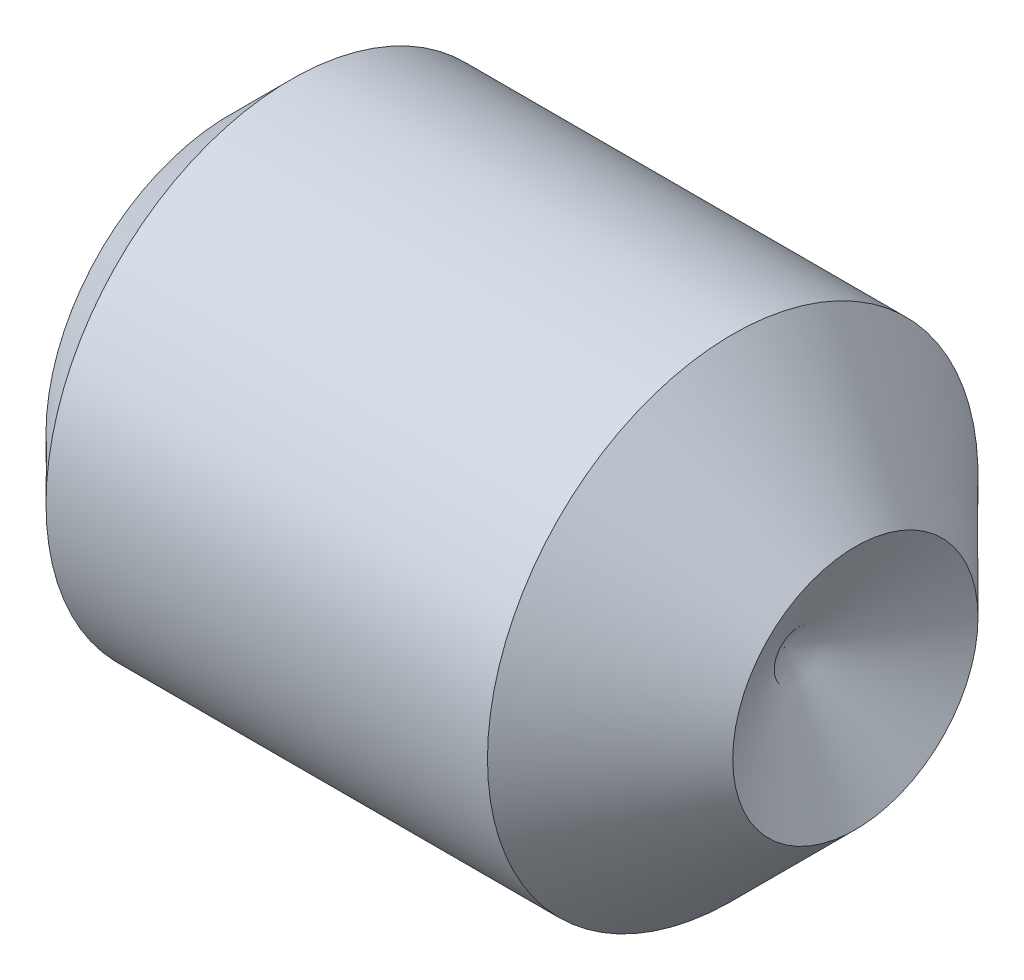
ISO-10303-21;
HEADER;
FILE_DESCRIPTION(('STEP AP214'),'2;1');
FILE_NAME('part.step','',(''),(''),'','','');
FILE_SCHEMA(('AUTOMOTIVE_DESIGN { 1 0 10303 214 1 1 1 1 }'));
ENDSEC;
DATA;
#1=APPLICATION_CONTEXT('core data for automotive mechanical design processes');
#2=APPLICATION_PROTOCOL_DEFINITION('international standard','automotive_design',2000,#1);
#3=PRODUCT_CONTEXT('',#1,'mechanical');
#4=PRODUCT('Part','Part','',(#3));
#5=PRODUCT_RELATED_PRODUCT_CATEGORY('part','',(#4));
#6=PRODUCT_DEFINITION_FORMATION('','',#4);
#7=PRODUCT_DEFINITION_CONTEXT('part definition',#1,'design');
#8=PRODUCT_DEFINITION('design','',#6,#7);
#9=PRODUCT_DEFINITION_SHAPE('','',#8);
#10=(LENGTH_UNIT() NAMED_UNIT(*) SI_UNIT(.MILLI.,.METRE.));
#11=(NAMED_UNIT(*) PLANE_ANGLE_UNIT() SI_UNIT($,.RADIAN.));
#12=(NAMED_UNIT(*) SI_UNIT($,.STERADIAN.) SOLID_ANGLE_UNIT());
#13=UNCERTAINTY_MEASURE_WITH_UNIT(LENGTH_MEASURE(1.E-05),#10,'distance_accuracy_value','');
#14=(GEOMETRIC_REPRESENTATION_CONTEXT(3) GLOBAL_UNCERTAINTY_ASSIGNED_CONTEXT((#13)) GLOBAL_UNIT_ASSIGNED_CONTEXT((#10,
#11,#12)) REPRESENTATION_CONTEXT('',''));
#15=CARTESIAN_POINT('',(0.,0.,0.));
#16=DIRECTION('',(0.,0.,1.));
#17=DIRECTION('',(1.,0.,0.));
#18=AXIS2_PLACEMENT_3D('',#15,#16,#17);
#19=CARTESIAN_POINT('',(2.,-0.999999999999993,0.57735026918962));
#20=DIRECTION('',(0.,-0.5,0.866025403784439));
#21=DIRECTION('',(0.,-0.866025403784439,-0.5));
#22=AXIS2_PLACEMENT_3D('',#19,#20,#21);
#23=PLANE('',#22);
#24=DIRECTION('',(1.,0.,0.));
#25=VECTOR('',#24,1.);
#26=CARTESIAN_POINT('',(2.,0.,1.15470053837925));
#27=LINE('',#26,#25);
#28=CARTESIAN_POINT('',(2.,0.,1.15470053837925));
#29=VERTEX_POINT('',#28);
#30=CARTESIAN_POINT('',(0.,0.,1.15470053837925));
#31=VERTEX_POINT('',#30);
#32=EDGE_CURVE('E87',#29,#31,#27,.F.);
#33=ORIENTED_EDGE('',*,*,#32,.F.);
#34=DIRECTION('',(0.,-0.866025403784439,-0.5));
#35=VECTOR('',#34,1.);
#36=CARTESIAN_POINT('',(2.,-0.999999999999993,0.57735026918962));
#37=LINE('',#36,#35);
#38=CARTESIAN_POINT('',(2.,-0.999999999999993,0.57735026918962));
#39=VERTEX_POINT('',#38);
#40=EDGE_CURVE('E69',#39,#29,#37,.F.);
#41=ORIENTED_EDGE('',*,*,#40,.F.);
#42=DIRECTION('',(1.,0.,0.));
#43=VECTOR('',#42,1.);
#44=CARTESIAN_POINT('',(2.,-0.999999999999993,0.57735026918962));
#45=LINE('',#44,#43);
#46=CARTESIAN_POINT('',(0.,-0.999999999999993,0.57735026918962));
#47=VERTEX_POINT('',#46);
#48=EDGE_CURVE('E90',#47,#39,#45,.T.);
#49=ORIENTED_EDGE('',*,*,#48,.F.);
#50=DIRECTION('',(0.,-0.866025403784439,-0.5));
#51=VECTOR('',#50,1.);
#52=CARTESIAN_POINT('',(0.,-0.999999999999993,0.57735026918962));
#53=LINE('',#52,#51);
#54=EDGE_CURVE('E77',#31,#47,#53,.T.);
#55=ORIENTED_EDGE('',*,*,#54,.F.);
#56=EDGE_LOOP('',(#33,#41,#49,#55));
#57=FACE_BOUND('',#56,.T.);
#58=ADVANCED_FACE('F17',(#57),#23,.F.);
#59=CARTESIAN_POINT('',(2.,1.,0.577350269189621));
#60=DIRECTION('',(0.,-0.499999999999999,-0.866025403784439));
#61=DIRECTION('',(0.,0.866025403784439,-0.499999999999999));
#62=AXIS2_PLACEMENT_3D('',#59,#60,#61);
#63=PLANE('',#62);
#64=DIRECTION('',(0.,0.866025403784439,-0.499999999999999));
#65=VECTOR('',#64,1.);
#66=CARTESIAN_POINT('',(2.,1.,0.577350269189621));
#67=LINE('',#66,#65);
#68=CARTESIAN_POINT('',(2.,1.,0.577350269189622));
#69=VERTEX_POINT('',#68);
#70=EDGE_CURVE('E84',#69,#29,#67,.F.);
#71=ORIENTED_EDGE('',*,*,#70,.T.);
#72=ORIENTED_EDGE('',*,*,#32,.T.);
#73=DIRECTION('',(0.,0.866025403784439,-0.499999999999999));
#74=VECTOR('',#73,1.);
#75=CARTESIAN_POINT('',(0.,1.,0.577350269189621));
#76=LINE('',#75,#74);
#77=CARTESIAN_POINT('',(0.,1.,0.577350269189622));
#78=VERTEX_POINT('',#77);
#79=EDGE_CURVE('E73',#31,#78,#76,.T.);
#80=ORIENTED_EDGE('',*,*,#79,.T.);
#81=DIRECTION('',(1.,0.,0.));
#82=VECTOR('',#81,1.);
#83=CARTESIAN_POINT('',(2.,1.,0.577350269189621));
#84=LINE('',#83,#82);
#85=EDGE_CURVE('E100',#78,#69,#84,.T.);
#86=ORIENTED_EDGE('',*,*,#85,.T.);
#87=EDGE_LOOP('',(#71,#72,#80,#86));
#88=FACE_BOUND('',#87,.T.);
#89=ADVANCED_FACE('F93',(#88),#63,.T.);
#90=CARTESIAN_POINT('',(2.,-0.999999999999993,0.57735026918962));
#91=DIRECTION('',(0.,1.,0.));
#92=DIRECTION('',(0.,0.,1.));
#93=AXIS2_PLACEMENT_3D('',#90,#91,#92);
#94=PLANE('',#93);
#95=DIRECTION('',(0.,0.,-1.));
#96=VECTOR('',#95,1.);
#97=CARTESIAN_POINT('',(2.,-0.999999999999993,0.577350269189621));
#98=LINE('',#97,#96);
#99=CARTESIAN_POINT('',(2.,-0.999999999999993,-0.577350269189629));
#100=VERTEX_POINT('',#99);
#101=EDGE_CURVE('E103',#39,#100,#98,.T.);
#102=ORIENTED_EDGE('',*,*,#101,.T.);
#103=DIRECTION('',(1.,0.,0.));
#104=VECTOR('',#103,1.);
#105=CARTESIAN_POINT('',(2.,-0.999999999999993,-0.577350269189629));
#106=LINE('',#105,#104);
#107=CARTESIAN_POINT('',(0.,-0.999999999999993,-0.577350269189629));
#108=VERTEX_POINT('',#107);
#109=EDGE_CURVE('E109',#108,#100,#106,.T.);
#110=ORIENTED_EDGE('',*,*,#109,.F.);
#111=DIRECTION('',(0.,0.,1.));
#112=VECTOR('',#111,1.);
#113=CARTESIAN_POINT('',(0.,-0.999999999999993,0.57735026918962));
#114=LINE('',#113,#112);
#115=EDGE_CURVE('E94',#108,#47,#114,.T.);
#116=ORIENTED_EDGE('',*,*,#115,.T.);
#117=ORIENTED_EDGE('',*,*,#48,.T.);
#118=EDGE_LOOP('',(#102,#110,#116,#117));
#119=FACE_BOUND('',#118,.T.);
#120=ADVANCED_FACE('F216',(#119),#94,.T.);
#121=CARTESIAN_POINT('',(2.,1.,0.577350269189621));
#122=DIRECTION('',(0.,1.,0.));
#123=DIRECTION('',(0.,0.,1.));
#124=AXIS2_PLACEMENT_3D('',#121,#122,#123);
#125=PLANE('',#124);
#126=DIRECTION('',(1.,0.,0.));
#127=VECTOR('',#126,1.);
#128=CARTESIAN_POINT('',(2.,1.,-0.577350269189628));
#129=LINE('',#128,#127);
#130=CARTESIAN_POINT('',(0.,1.,-0.577350269189628));
#131=VERTEX_POINT('',#130);
#132=CARTESIAN_POINT('',(2.,1.,-0.577350269189628));
#133=VERTEX_POINT('',#132);
#134=EDGE_CURVE('E115',#131,#133,#129,.T.);
#135=ORIENTED_EDGE('',*,*,#134,.T.);
#136=DIRECTION('',(0.,0.,-1.));
#137=VECTOR('',#136,1.);
#138=CARTESIAN_POINT('',(2.,1.,0.577350269189621));
#139=LINE('',#138,#137);
#140=EDGE_CURVE('E105',#133,#69,#139,.F.);
#141=ORIENTED_EDGE('',*,*,#140,.T.);
#142=ORIENTED_EDGE('',*,*,#85,.F.);
#143=DIRECTION('',(0.,0.,1.));
#144=VECTOR('',#143,1.);
#145=CARTESIAN_POINT('',(0.,1.,0.577350269189621));
#146=LINE('',#145,#144);
#147=EDGE_CURVE('E79',#131,#78,#146,.T.);
#148=ORIENTED_EDGE('',*,*,#147,.F.);
#149=EDGE_LOOP('',(#135,#141,#142,#148));
#150=FACE_BOUND('',#149,.T.);
#151=ADVANCED_FACE('F207',(#150),#125,.F.);
#152=CARTESIAN_POINT('',(2.,1.,0.577350269189621));
#153=DIRECTION('',(1.,0.,0.));
#154=DIRECTION('',(0.,0.,-1.));
#155=AXIS2_PLACEMENT_3D('',#152,#153,#154);
#156=PLANE('',#155);
#157=ORIENTED_EDGE('',*,*,#140,.F.);
#158=DIRECTION('',(0.,0.866025403784439,0.5));
#159=VECTOR('',#158,1.);
#160=CARTESIAN_POINT('',(2.,1.,-0.577350269189628));
#161=LINE('',#160,#159);
#162=CARTESIAN_POINT('',(2.,0.,-1.15470053837925));
#163=VERTEX_POINT('',#162);
#164=EDGE_CURVE('E117',#133,#163,#161,.F.);
#165=ORIENTED_EDGE('',*,*,#164,.T.);
#166=DIRECTION('',(0.,-0.866025403784439,0.499999999999999));
#167=VECTOR('',#166,1.);
#168=CARTESIAN_POINT('',(2.,-0.999999999999993,-0.577350269189629));
#169=LINE('',#168,#167);
#170=EDGE_CURVE('E112',#100,#163,#169,.F.);
#171=ORIENTED_EDGE('',*,*,#170,.F.);
#172=ORIENTED_EDGE('',*,*,#101,.F.);
#173=ORIENTED_EDGE('',*,*,#40,.T.);
#174=ORIENTED_EDGE('',*,*,#70,.F.);
#175=EDGE_LOOP('',(#157,#165,#171,#172,#173,#174));
#176=FACE_BOUND('',#175,.T.);
#177=ADVANCED_FACE('F197',(#176),#156,.F.);
#178=CARTESIAN_POINT('',(2.,-0.999999999999993,-0.577350269189629));
#179=DIRECTION('',(0.,0.499999999999999,0.866025403784439));
#180=DIRECTION('',(0.,-0.866025403784439,0.499999999999999));
#181=AXIS2_PLACEMENT_3D('',#178,#179,#180);
#182=PLANE('',#181);
#183=ORIENTED_EDGE('',*,*,#170,.T.);
#184=DIRECTION('',(1.,0.,0.));
#185=VECTOR('',#184,1.);
#186=CARTESIAN_POINT('',(2.,0.,-1.15470053837925));
#187=LINE('',#186,#185);
#188=CARTESIAN_POINT('',(0.,0.,-1.15470053837925));
#189=VERTEX_POINT('',#188);
#190=EDGE_CURVE('E119',#163,#189,#187,.F.);
#191=ORIENTED_EDGE('',*,*,#190,.T.);
#192=DIRECTION('',(0.,-0.866025403784439,0.499999999999999));
#193=VECTOR('',#192,1.);
#194=CARTESIAN_POINT('',(0.,-0.999999999999993,-0.577350269189629));
#195=LINE('',#194,#193);
#196=EDGE_CURVE('E35',#189,#108,#195,.T.);
#197=ORIENTED_EDGE('',*,*,#196,.T.);
#198=ORIENTED_EDGE('',*,*,#109,.T.);
#199=EDGE_LOOP('',(#183,#191,#197,#198));
#200=FACE_BOUND('',#199,.T.);
#201=ADVANCED_FACE('F187',(#200),#182,.T.);
#202=CARTESIAN_POINT('',(2.,1.,-0.577350269189628));
#203=DIRECTION('',(0.,0.5,-0.866025403784439));
#204=DIRECTION('',(0.,0.866025403784439,0.5));
#205=AXIS2_PLACEMENT_3D('',#202,#203,#204);
#206=PLANE('',#205);
#207=ORIENTED_EDGE('',*,*,#190,.F.);
#208=ORIENTED_EDGE('',*,*,#164,.F.);
#209=ORIENTED_EDGE('',*,*,#134,.F.);
#210=DIRECTION('',(0.,0.866025403784438,0.5));
#211=VECTOR('',#210,1.);
#212=CARTESIAN_POINT('',(0.,0.,-1.15470053837925));
#213=LINE('',#212,#211);
#214=EDGE_CURVE('E121',#189,#131,#213,.T.);
#215=ORIENTED_EDGE('',*,*,#214,.F.);
#216=EDGE_LOOP('',(#207,#208,#209,#215));
#217=FACE_BOUND('',#216,.T.);
#218=ADVANCED_FACE('F144',(#217),#206,.F.);
#219=CARTESIAN_POINT('',(5.1000000000001,0.,0.));
#220=DIRECTION('',(1.,0.,0.));
#221=DIRECTION('',(0.,0.,-1.));
#222=AXIS2_PLACEMENT_3D('',#219,#220,#221);
#223=CONICAL_SURFACE('',#222,1.00000000000011,1.04719755119659);
#224=CARTESIAN_POINT('',(4.5226497308104,0.,0.));
#225=VERTEX_POINT('',#224);
#226=VERTEX_LOOP('',#225);
#227=FACE_BOUND('',#226,.T.);
#228=CARTESIAN_POINT('',(5.09999999997035,0.,0.));
#229=DIRECTION('',(-1.,0.,0.));
#230=DIRECTION('',(0.,0.,1.));
#231=AXIS2_PLACEMENT_3D('',#228,#229,#230);
#232=CIRCLE('',#231,0.999999999976353);
#233=CARTESIAN_POINT('',(5.09999999997035,0.,0.999999999976353));
#234=VERTEX_POINT('',#233);
#235=EDGE_CURVE('E123',#234,#234,#232,.T.);
#236=ORIENTED_EDGE('',*,*,#235,.F.);
#237=EDGE_LOOP('',(#236));
#238=FACE_BOUND('',#237,.T.);
#239=ADVANCED_FACE('F135',(#227,#238),#223,.F.);
#240=CARTESIAN_POINT('',(0.,0.,0.));
#241=DIRECTION('',(-1.,0.,0.));
#242=DIRECTION('',(0.,0.,1.));
#243=AXIS2_PLACEMENT_3D('',#240,#241,#242);
#244=PLANE('',#243);
#245=ORIENTED_EDGE('',*,*,#196,.F.);
#246=ORIENTED_EDGE('',*,*,#214,.T.);
#247=ORIENTED_EDGE('',*,*,#147,.T.);
#248=ORIENTED_EDGE('',*,*,#79,.F.);
#249=ORIENTED_EDGE('',*,*,#54,.T.);
#250=ORIENTED_EDGE('',*,*,#115,.F.);
#251=EDGE_LOOP('',(#245,#246,#247,#248,#249,#250));
#252=FACE_BOUND('',#251,.T.);
#253=CARTESIAN_POINT('',(5.6843418860808E-11,0.,0.));
#254=DIRECTION('',(1.,0.,0.));
#255=DIRECTION('',(0.,0.,-1.));
#256=AXIS2_PLACEMENT_3D('',#253,#254,#255);
#257=CIRCLE('',#256,1.50000000002137);
#258=CARTESIAN_POINT('',(5.6843418860808E-11,0.,-1.50000000002137));
#259=VERTEX_POINT('',#258);
#260=EDGE_CURVE('E20',#259,#259,#257,.T.);
#261=ORIENTED_EDGE('',*,*,#260,.F.);
#262=EDGE_LOOP('',(#261));
#263=FACE_BOUND('',#262,.T.);
#264=ADVANCED_FACE('F75',(#252,#263),#244,.T.);
#265=CARTESIAN_POINT('',(4.09999999993715,0.,0.));
#266=DIRECTION('',(-1.,0.,0.));
#267=DIRECTION('',(0.,0.,1.));
#268=AXIS2_PLACEMENT_3D('',#265,#266,#267);
#269=CONICAL_SURFACE('',#268,2.00000000000955,0.785398163397448);
#270=CARTESIAN_POINT('',(4.1,0.,0.));
#271=DIRECTION('',(-1.,0.,0.));
#272=DIRECTION('',(0.,0.,1.));
#273=AXIS2_PLACEMENT_3D('',#270,#271,#272);
#274=CIRCLE('',#273,2.);
#275=CARTESIAN_POINT('',(4.1,0.,2.));
#276=VERTEX_POINT('',#275);
#277=EDGE_CURVE('E26',#276,#276,#274,.T.);
#278=ORIENTED_EDGE('',*,*,#277,.F.);
#279=EDGE_LOOP('',(#278));
#280=FACE_BOUND('',#279,.T.);
#281=ORIENTED_EDGE('',*,*,#235,.T.);
#282=EDGE_LOOP('',(#281));
#283=FACE_BOUND('',#282,.T.);
#284=ADVANCED_FACE('F134',(#280,#283),#269,.T.);
#285=CARTESIAN_POINT('',(0.50000000004502,0.,0.));
#286=DIRECTION('',(1.,0.,0.));
#287=DIRECTION('',(0.,0.,-1.));
#288=AXIS2_PLACEMENT_3D('',#285,#286,#287);
#289=CONICAL_SURFACE('',#288,2.00000000000955,0.785398163397448);
#290=CARTESIAN_POINT('',(0.499999999999997,0.,0.));
#291=DIRECTION('',(-1.,0.,0.));
#292=DIRECTION('',(0.,0.,1.));
#293=AXIS2_PLACEMENT_3D('',#290,#291,#292);
#294=CIRCLE('',#293,2.);
#295=CARTESIAN_POINT('',(0.499999999999997,0.,2.));
#296=VERTEX_POINT('',#295);
#297=EDGE_CURVE('E11',#296,#296,#294,.F.);
#298=ORIENTED_EDGE('',*,*,#297,.F.);
#299=EDGE_LOOP('',(#298));
#300=FACE_BOUND('',#299,.T.);
#301=ORIENTED_EDGE('',*,*,#260,.T.);
#302=EDGE_LOOP('',(#301));
#303=FACE_BOUND('',#302,.T.);
#304=ADVANCED_FACE('F132',(#300,#303),#289,.T.);
#305=CARTESIAN_POINT('',(-12.7,0.,0.));
#306=DIRECTION('',(-1.,0.,0.));
#307=DIRECTION('',(0.,0.,1.));
#308=AXIS2_PLACEMENT_3D('',#305,#306,#307);
#309=CYLINDRICAL_SURFACE('',#308,2.);
#310=ORIENTED_EDGE('',*,*,#297,.T.);
#311=EDGE_LOOP('',(#310));
#312=FACE_BOUND('',#311,.T.);
#313=ORIENTED_EDGE('',*,*,#277,.T.);
#314=EDGE_LOOP('',(#313));
#315=FACE_BOUND('',#314,.T.);
#316=ADVANCED_FACE('F147',(#312,#315),#309,.T.);
#317=CLOSED_SHELL('',(#58,#89,#120,#151,#177,#201,#218,#239,#264,#284,#304,#316));
#318=MANIFOLD_SOLID_BREP('B1',#317);
#319=ADVANCED_BREP_SHAPE_REPRESENTATION('',(#18,#318),#14);
#320=SHAPE_DEFINITION_REPRESENTATION(#9,#319);
ENDSEC;
END-ISO-10303-21;
